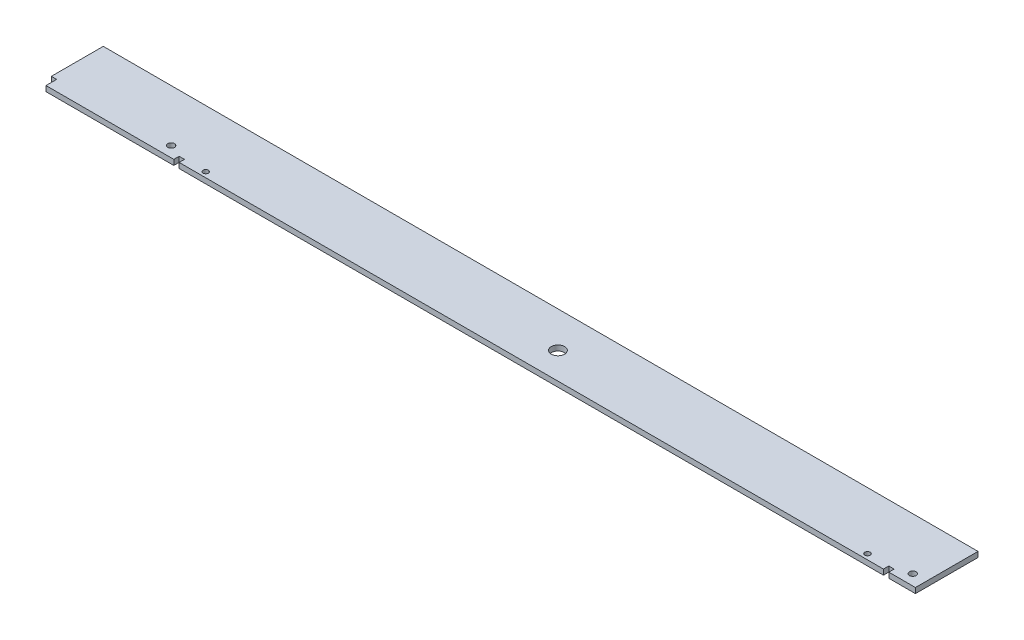
ISO-10303-21;
HEADER;
FILE_DESCRIPTION(('STEP AP214'),'2;1');
FILE_NAME('part.step','',(''),(''),'','','');
FILE_SCHEMA(('AUTOMOTIVE_DESIGN { 1 0 10303 214 1 1 1 1 }'));
ENDSEC;
DATA;
#1=APPLICATION_CONTEXT('core data for automotive mechanical design processes');
#2=APPLICATION_PROTOCOL_DEFINITION('international standard','automotive_design',2000,#1);
#3=PRODUCT_CONTEXT('',#1,'mechanical');
#4=PRODUCT('Part','Part','',(#3));
#5=PRODUCT_RELATED_PRODUCT_CATEGORY('part','',(#4));
#6=PRODUCT_DEFINITION_FORMATION('','',#4);
#7=PRODUCT_DEFINITION_CONTEXT('part definition',#1,'design');
#8=PRODUCT_DEFINITION('design','',#6,#7);
#9=PRODUCT_DEFINITION_SHAPE('','',#8);
#10=(LENGTH_UNIT() NAMED_UNIT(*) SI_UNIT(.MILLI.,.METRE.));
#11=(NAMED_UNIT(*) PLANE_ANGLE_UNIT() SI_UNIT($,.RADIAN.));
#12=(NAMED_UNIT(*) SI_UNIT($,.STERADIAN.) SOLID_ANGLE_UNIT());
#13=UNCERTAINTY_MEASURE_WITH_UNIT(LENGTH_MEASURE(1.E-05),#10,'distance_accuracy_value','');
#14=(GEOMETRIC_REPRESENTATION_CONTEXT(3) GLOBAL_UNCERTAINTY_ASSIGNED_CONTEXT((#13)) GLOBAL_UNIT_ASSIGNED_CONTEXT((#10,
#11,#12)) REPRESENTATION_CONTEXT('',''));
#15=CARTESIAN_POINT('',(0.,0.,0.));
#16=DIRECTION('',(0.,0.,1.));
#17=DIRECTION('',(1.,0.,0.));
#18=AXIS2_PLACEMENT_3D('',#15,#16,#17);
#19=CARTESIAN_POINT('',(0.,4.,0.));
#20=DIRECTION('',(0.,1.,0.));
#21=DIRECTION('',(0.,0.,1.));
#22=AXIS2_PLACEMENT_3D('',#19,#20,#21);
#23=PLANE('',#22);
#24=DIRECTION('',(0.,0.,1.));
#25=VECTOR('',#24,1.);
#26=CARTESIAN_POINT('',(-782.880346614095,4.,180.385173028405));
#27=LINE('',#26,#25);
#28=CARTESIAN_POINT('',(-782.880346614095,4.,172.385173028405));
#29=VERTEX_POINT('',#28);
#30=CARTESIAN_POINT('',(-782.880346614095,4.,180.385173028405));
#31=VERTEX_POINT('',#30);
#32=EDGE_CURVE('E264',#29,#31,#27,.T.);
#33=ORIENTED_EDGE('',*,*,#32,.T.);
#34=DIRECTION('',(1.,0.,0.));
#35=VECTOR('',#34,1.);
#36=CARTESIAN_POINT('',(-686.880346614095,4.,180.385173028405));
#37=LINE('',#36,#35);
#38=CARTESIAN_POINT('',(-686.880346614095,4.,180.385173028405));
#39=VERTEX_POINT('',#38);
#40=EDGE_CURVE('E321',#31,#39,#37,.T.);
#41=ORIENTED_EDGE('',*,*,#40,.T.);
#42=DIRECTION('',(0.,0.,-1.));
#43=VECTOR('',#42,1.);
#44=CARTESIAN_POINT('',(-686.880346614095,4.,176.385173028405));
#45=LINE('',#44,#43);
#46=CARTESIAN_POINT('',(-686.880346614095,4.,176.385173028405));
#47=VERTEX_POINT('',#46);
#48=EDGE_CURVE('E324',#39,#47,#45,.T.);
#49=ORIENTED_EDGE('',*,*,#48,.T.);
#50=DIRECTION('',(1.,0.,0.));
#51=VECTOR('',#50,1.);
#52=CARTESIAN_POINT('',(-682.880346614095,4.,176.385173028405));
#53=LINE('',#52,#51);
#54=CARTESIAN_POINT('',(-682.880346614095,4.,176.385173028405));
#55=VERTEX_POINT('',#54);
#56=EDGE_CURVE('E327',#47,#55,#53,.T.);
#57=ORIENTED_EDGE('',*,*,#56,.T.);
#58=DIRECTION('',(0.,0.,1.));
#59=VECTOR('',#58,1.);
#60=CARTESIAN_POINT('',(-682.880346614095,4.,180.385173028405));
#61=LINE('',#60,#59);
#62=CARTESIAN_POINT('',(-682.880346614095,4.,180.385173028405));
#63=VERTEX_POINT('',#62);
#64=EDGE_CURVE('E330',#55,#63,#61,.T.);
#65=ORIENTED_EDGE('',*,*,#64,.T.);
#66=DIRECTION('',(1.,0.,0.));
#67=VECTOR('',#66,1.);
#68=CARTESIAN_POINT('',(-153.880346614095,4.,180.385173028405));
#69=LINE('',#68,#67);
#70=CARTESIAN_POINT('',(-153.880346614095,4.,180.385173028405));
#71=VERTEX_POINT('',#70);
#72=EDGE_CURVE('E333',#63,#71,#69,.T.);
#73=ORIENTED_EDGE('',*,*,#72,.T.);
#74=DIRECTION('',(0.,0.,-1.));
#75=VECTOR('',#74,1.);
#76=CARTESIAN_POINT('',(-153.880346614095,4.,176.385173028405));
#77=LINE('',#76,#75);
#78=CARTESIAN_POINT('',(-153.880346614095,4.,176.385173028405));
#79=VERTEX_POINT('',#78);
#80=EDGE_CURVE('E149',#71,#79,#77,.T.);
#81=ORIENTED_EDGE('',*,*,#80,.T.);
#82=DIRECTION('',(1.,0.,0.));
#83=VECTOR('',#82,1.);
#84=CARTESIAN_POINT('',(-149.880346614095,4.,176.385173028405));
#85=LINE('',#84,#83);
#86=CARTESIAN_POINT('',(-149.880346614095,4.,176.385173028405));
#87=VERTEX_POINT('',#86);
#88=EDGE_CURVE('E141',#79,#87,#85,.T.);
#89=ORIENTED_EDGE('',*,*,#88,.T.);
#90=DIRECTION('',(0.,0.,1.));
#91=VECTOR('',#90,1.);
#92=CARTESIAN_POINT('',(-149.880346614095,4.,180.385173028405));
#93=LINE('',#92,#91);
#94=CARTESIAN_POINT('',(-149.880346614095,4.,180.385173028405));
#95=VERTEX_POINT('',#94);
#96=EDGE_CURVE('E146',#87,#95,#93,.T.);
#97=ORIENTED_EDGE('',*,*,#96,.T.);
#98=DIRECTION('',(1.,0.,0.));
#99=VECTOR('',#98,1.);
#100=CARTESIAN_POINT('',(-129.880346614095,4.,180.385173028405));
#101=LINE('',#100,#99);
#102=CARTESIAN_POINT('',(-129.880346614095,4.,180.385173028405));
#103=VERTEX_POINT('',#102);
#104=EDGE_CURVE('E66',#95,#103,#101,.T.);
#105=ORIENTED_EDGE('',*,*,#104,.T.);
#106=DIRECTION('',(0.,0.,-1.));
#107=VECTOR('',#106,1.);
#108=CARTESIAN_POINT('',(-129.880346614095,4.,180.385173028405));
#109=LINE('',#108,#107);
#110=CARTESIAN_POINT('',(-129.880346614095,4.,133.385173028405));
#111=VERTEX_POINT('',#110);
#112=EDGE_CURVE('E211',#103,#111,#109,.T.);
#113=ORIENTED_EDGE('',*,*,#112,.T.);
#114=DIRECTION('',(-1.,0.,0.));
#115=VECTOR('',#114,1.);
#116=CARTESIAN_POINT('',(-129.880346614095,4.,133.385173028405));
#117=LINE('',#116,#115);
#118=CARTESIAN_POINT('',(-786.880346614095,4.,133.385173028405));
#119=VERTEX_POINT('',#118);
#120=EDGE_CURVE('E116',#111,#119,#117,.T.);
#121=ORIENTED_EDGE('',*,*,#120,.T.);
#122=DIRECTION('',(0.,0.,1.));
#123=VECTOR('',#122,1.);
#124=CARTESIAN_POINT('',(-786.880346614095,4.,180.385173028405));
#125=LINE('',#124,#123);
#126=CARTESIAN_POINT('',(-786.880346614095,4.,172.385173028405));
#127=VERTEX_POINT('',#126);
#128=EDGE_CURVE('E246',#119,#127,#125,.T.);
#129=ORIENTED_EDGE('',*,*,#128,.T.);
#130=DIRECTION('',(1.,0.,0.));
#131=VECTOR('',#130,1.);
#132=CARTESIAN_POINT('',(-786.880346614095,4.,172.385173028405));
#133=LINE('',#132,#131);
#134=EDGE_CURVE('E261',#127,#29,#133,.T.);
#135=ORIENTED_EDGE('',*,*,#134,.T.);
#136=EDGE_LOOP('',(#33,#41,#49,#57,#65,#73,#81,#89,#97,#105,#113,#121,#129,#135));
#137=FACE_BOUND('',#136,.T.);
#138=CARTESIAN_POINT('',(-169.880346614095,4.,176.385173028405));
#139=DIRECTION('',(0.,1.,0.));
#140=DIRECTION('',(0.,0.,1.));
#141=AXIS2_PLACEMENT_3D('',#138,#139,#140);
#142=CIRCLE('',#141,2.);
#143=CARTESIAN_POINT('',(-169.880346614095,4.,178.385173028405));
#144=VERTEX_POINT('',#143);
#145=EDGE_CURVE('E285',#144,#144,#142,.T.);
#146=ORIENTED_EDGE('',*,*,#145,.F.);
#147=EDGE_LOOP('',(#146));
#148=FACE_BOUND('',#147,.T.);
#149=CARTESIAN_POINT('',(-139.880346614095,4.,172.385173028405));
#150=DIRECTION('',(0.,1.,0.));
#151=DIRECTION('',(0.,0.,1.));
#152=AXIS2_PLACEMENT_3D('',#149,#150,#151);
#153=CIRCLE('',#152,2.50000000000003);
#154=CARTESIAN_POINT('',(-139.880346614095,4.,174.885173028405));
#155=VERTEX_POINT('',#154);
#156=EDGE_CURVE('E301',#155,#155,#153,.T.);
#157=ORIENTED_EDGE('',*,*,#156,.F.);
#158=EDGE_LOOP('',(#157));
#159=FACE_BOUND('',#158,.T.);
#160=CARTESIAN_POINT('',(-696.880346614095,4.,172.385173028405));
#161=DIRECTION('',(0.,1.,0.));
#162=DIRECTION('',(0.,0.,1.));
#163=AXIS2_PLACEMENT_3D('',#160,#161,#162);
#164=CIRCLE('',#163,2.50000000000002);
#165=CARTESIAN_POINT('',(-696.880346614095,4.,174.885173028405));
#166=VERTEX_POINT('',#165);
#167=EDGE_CURVE('E179',#166,#166,#164,.T.);
#168=ORIENTED_EDGE('',*,*,#167,.F.);
#169=EDGE_LOOP('',(#168));
#170=FACE_BOUND('',#169,.T.);
#171=CARTESIAN_POINT('',(-666.880346614095,4.,176.385173028405));
#172=DIRECTION('',(0.,1.,0.));
#173=DIRECTION('',(0.,0.,1.));
#174=AXIS2_PLACEMENT_3D('',#171,#172,#173);
#175=CIRCLE('',#174,2.);
#176=CARTESIAN_POINT('',(-666.880346614095,4.,178.385173028405));
#177=VERTEX_POINT('',#176);
#178=EDGE_CURVE('E293',#177,#177,#175,.T.);
#179=ORIENTED_EDGE('',*,*,#178,.F.);
#180=EDGE_LOOP('',(#179));
#181=FACE_BOUND('',#180,.T.);
#182=CARTESIAN_POINT('',(-418.380346614095,4.,160.385173028405));
#183=DIRECTION('',(0.,1.,0.));
#184=DIRECTION('',(0.,0.,1.));
#185=AXIS2_PLACEMENT_3D('',#182,#183,#184);
#186=CIRCLE('',#185,4.99999999999999);
#187=CARTESIAN_POINT('',(-418.380346614095,4.,165.385173028405));
#188=VERTEX_POINT('',#187);
#189=EDGE_CURVE('E277',#188,#188,#186,.T.);
#190=ORIENTED_EDGE('',*,*,#189,.F.);
#191=EDGE_LOOP('',(#190));
#192=FACE_BOUND('',#191,.T.);
#193=ADVANCED_FACE('F41',(#137,#148,#159,#170,#181,#192),#23,.T.);
#194=CARTESIAN_POINT('',(0.,0.,0.));
#195=DIRECTION('',(0.,1.,0.));
#196=DIRECTION('',(0.,0.,1.));
#197=AXIS2_PLACEMENT_3D('',#194,#195,#196);
#198=PLANE('',#197);
#199=DIRECTION('',(1.,0.,0.));
#200=VECTOR('',#199,1.);
#201=CARTESIAN_POINT('',(-686.880346614095,0.,180.385173028405));
#202=LINE('',#201,#200);
#203=CARTESIAN_POINT('',(-782.880346614095,0.,180.385173028405));
#204=VERTEX_POINT('',#203);
#205=CARTESIAN_POINT('',(-686.880346614095,0.,180.385173028405));
#206=VERTEX_POINT('',#205);
#207=EDGE_CURVE('E186',#204,#206,#202,.T.);
#208=ORIENTED_EDGE('',*,*,#207,.F.);
#209=DIRECTION('',(0.,0.,1.));
#210=VECTOR('',#209,1.);
#211=CARTESIAN_POINT('',(-782.880346614095,0.,180.385173028405));
#212=LINE('',#211,#210);
#213=CARTESIAN_POINT('',(-782.880346614095,0.,172.385173028405));
#214=VERTEX_POINT('',#213);
#215=EDGE_CURVE('E57',#214,#204,#212,.T.);
#216=ORIENTED_EDGE('',*,*,#215,.F.);
#217=DIRECTION('',(1.,0.,0.));
#218=VECTOR('',#217,1.);
#219=CARTESIAN_POINT('',(-786.880346614095,0.,172.385173028405));
#220=LINE('',#219,#218);
#221=CARTESIAN_POINT('',(-786.880346614095,0.,172.385173028405));
#222=VERTEX_POINT('',#221);
#223=EDGE_CURVE('E254',#222,#214,#220,.T.);
#224=ORIENTED_EDGE('',*,*,#223,.F.);
#225=DIRECTION('',(0.,0.,1.));
#226=VECTOR('',#225,1.);
#227=CARTESIAN_POINT('',(-786.880346614095,0.,180.385173028405));
#228=LINE('',#227,#226);
#229=CARTESIAN_POINT('',(-786.880346614095,0.,133.385173028405));
#230=VERTEX_POINT('',#229);
#231=EDGE_CURVE('E182',#230,#222,#228,.T.);
#232=ORIENTED_EDGE('',*,*,#231,.F.);
#233=DIRECTION('',(-1.,0.,0.));
#234=VECTOR('',#233,1.);
#235=CARTESIAN_POINT('',(-129.880346614095,0.,133.385173028405));
#236=LINE('',#235,#234);
#237=CARTESIAN_POINT('',(-129.880346614095,0.,133.385173028405));
#238=VERTEX_POINT('',#237);
#239=EDGE_CURVE('E178',#238,#230,#236,.T.);
#240=ORIENTED_EDGE('',*,*,#239,.F.);
#241=DIRECTION('',(0.,0.,-1.));
#242=VECTOR('',#241,1.);
#243=CARTESIAN_POINT('',(-129.880346614095,0.,180.385173028405));
#244=LINE('',#243,#242);
#245=CARTESIAN_POINT('',(-129.880346614095,0.,180.385173028405));
#246=VERTEX_POINT('',#245);
#247=EDGE_CURVE('E174',#246,#238,#244,.T.);
#248=ORIENTED_EDGE('',*,*,#247,.F.);
#249=DIRECTION('',(1.,0.,0.));
#250=VECTOR('',#249,1.);
#251=CARTESIAN_POINT('',(-129.880346614095,0.,180.385173028405));
#252=LINE('',#251,#250);
#253=CARTESIAN_POINT('',(-149.880346614095,0.,180.385173028405));
#254=VERTEX_POINT('',#253);
#255=EDGE_CURVE('E108',#254,#246,#252,.T.);
#256=ORIENTED_EDGE('',*,*,#255,.F.);
#257=DIRECTION('',(0.,0.,1.));
#258=VECTOR('',#257,1.);
#259=CARTESIAN_POINT('',(-149.880346614095,0.,180.385173028405));
#260=LINE('',#259,#258);
#261=CARTESIAN_POINT('',(-149.880346614095,0.,176.385173028405));
#262=VERTEX_POINT('',#261);
#263=EDGE_CURVE('E206',#262,#254,#260,.T.);
#264=ORIENTED_EDGE('',*,*,#263,.F.);
#265=DIRECTION('',(1.,0.,0.));
#266=VECTOR('',#265,1.);
#267=CARTESIAN_POINT('',(-149.880346614095,0.,176.385173028405));
#268=LINE('',#267,#266);
#269=CARTESIAN_POINT('',(-153.880346614095,0.,176.385173028405));
#270=VERTEX_POINT('',#269);
#271=EDGE_CURVE('E159',#270,#262,#268,.T.);
#272=ORIENTED_EDGE('',*,*,#271,.F.);
#273=DIRECTION('',(0.,0.,-1.));
#274=VECTOR('',#273,1.);
#275=CARTESIAN_POINT('',(-153.880346614095,0.,176.385173028405));
#276=LINE('',#275,#274);
#277=CARTESIAN_POINT('',(-153.880346614095,0.,180.385173028405));
#278=VERTEX_POINT('',#277);
#279=EDGE_CURVE('E201',#278,#270,#276,.T.);
#280=ORIENTED_EDGE('',*,*,#279,.F.);
#281=DIRECTION('',(1.,0.,0.));
#282=VECTOR('',#281,1.);
#283=CARTESIAN_POINT('',(-153.880346614095,0.,180.385173028405));
#284=LINE('',#283,#282);
#285=CARTESIAN_POINT('',(-682.880346614095,0.,180.385173028405));
#286=VERTEX_POINT('',#285);
#287=EDGE_CURVE('E198',#286,#278,#284,.T.);
#288=ORIENTED_EDGE('',*,*,#287,.F.);
#289=DIRECTION('',(0.,0.,1.));
#290=VECTOR('',#289,1.);
#291=CARTESIAN_POINT('',(-682.880346614095,0.,180.385173028405));
#292=LINE('',#291,#290);
#293=CARTESIAN_POINT('',(-682.880346614095,0.,176.385173028405));
#294=VERTEX_POINT('',#293);
#295=EDGE_CURVE('E195',#294,#286,#292,.T.);
#296=ORIENTED_EDGE('',*,*,#295,.F.);
#297=DIRECTION('',(1.,0.,0.));
#298=VECTOR('',#297,1.);
#299=CARTESIAN_POINT('',(-682.880346614095,0.,176.385173028405));
#300=LINE('',#299,#298);
#301=CARTESIAN_POINT('',(-686.880346614095,0.,176.385173028405));
#302=VERTEX_POINT('',#301);
#303=EDGE_CURVE('E192',#302,#294,#300,.T.);
#304=ORIENTED_EDGE('',*,*,#303,.F.);
#305=DIRECTION('',(0.,0.,-1.));
#306=VECTOR('',#305,1.);
#307=CARTESIAN_POINT('',(-686.880346614095,0.,176.385173028405));
#308=LINE('',#307,#306);
#309=EDGE_CURVE('E189',#206,#302,#308,.T.);
#310=ORIENTED_EDGE('',*,*,#309,.F.);
#311=EDGE_LOOP('',(#208,#216,#224,#232,#240,#248,#256,#264,#272,#280,#288,#296,#304,#310));
#312=FACE_BOUND('',#311,.T.);
#313=CARTESIAN_POINT('',(-696.880346614095,0.,172.385173028405));
#314=DIRECTION('',(0.,1.,0.));
#315=DIRECTION('',(0.,0.,1.));
#316=AXIS2_PLACEMENT_3D('',#313,#314,#315);
#317=CIRCLE('',#316,2.50000000000002);
#318=CARTESIAN_POINT('',(-696.880346614095,0.,174.885173028405));
#319=VERTEX_POINT('',#318);
#320=EDGE_CURVE('E305',#319,#319,#317,.T.);
#321=ORIENTED_EDGE('',*,*,#320,.T.);
#322=EDGE_LOOP('',(#321));
#323=FACE_BOUND('',#322,.T.);
#324=CARTESIAN_POINT('',(-139.880346614095,0.,172.385173028405));
#325=DIRECTION('',(0.,1.,0.));
#326=DIRECTION('',(0.,0.,1.));
#327=AXIS2_PLACEMENT_3D('',#324,#325,#326);
#328=CIRCLE('',#327,2.50000000000003);
#329=CARTESIAN_POINT('',(-139.880346614095,0.,174.885173028405));
#330=VERTEX_POINT('',#329);
#331=EDGE_CURVE('E297',#330,#330,#328,.T.);
#332=ORIENTED_EDGE('',*,*,#331,.T.);
#333=EDGE_LOOP('',(#332));
#334=FACE_BOUND('',#333,.T.);
#335=CARTESIAN_POINT('',(-666.880346614095,0.,176.385173028405));
#336=DIRECTION('',(0.,1.,0.));
#337=DIRECTION('',(0.,0.,1.));
#338=AXIS2_PLACEMENT_3D('',#335,#336,#337);
#339=CIRCLE('',#338,2.);
#340=CARTESIAN_POINT('',(-666.880346614095,0.,178.385173028405));
#341=VERTEX_POINT('',#340);
#342=EDGE_CURVE('E289',#341,#341,#339,.T.);
#343=ORIENTED_EDGE('',*,*,#342,.T.);
#344=EDGE_LOOP('',(#343));
#345=FACE_BOUND('',#344,.T.);
#346=CARTESIAN_POINT('',(-169.880346614095,0.,176.385173028405));
#347=DIRECTION('',(0.,1.,0.));
#348=DIRECTION('',(0.,0.,1.));
#349=AXIS2_PLACEMENT_3D('',#346,#347,#348);
#350=CIRCLE('',#349,2.);
#351=CARTESIAN_POINT('',(-169.880346614095,0.,178.385173028405));
#352=VERTEX_POINT('',#351);
#353=EDGE_CURVE('E281',#352,#352,#350,.T.);
#354=ORIENTED_EDGE('',*,*,#353,.T.);
#355=EDGE_LOOP('',(#354));
#356=FACE_BOUND('',#355,.T.);
#357=CARTESIAN_POINT('',(-418.380346614095,0.,160.385173028405));
#358=DIRECTION('',(0.,1.,0.));
#359=DIRECTION('',(0.,0.,1.));
#360=AXIS2_PLACEMENT_3D('',#357,#358,#359);
#361=CIRCLE('',#360,4.99999999999999);
#362=CARTESIAN_POINT('',(-418.380346614095,0.,165.385173028405));
#363=VERTEX_POINT('',#362);
#364=EDGE_CURVE('E270',#363,#363,#361,.T.);
#365=ORIENTED_EDGE('',*,*,#364,.T.);
#366=EDGE_LOOP('',(#365));
#367=FACE_BOUND('',#366,.T.);
#368=ADVANCED_FACE('F250',(#312,#323,#334,#345,#356,#367),#198,.F.);
#369=CARTESIAN_POINT('',(-129.880346614095,4.,180.385173028405));
#370=DIRECTION('',(-1.,0.,0.));
#371=DIRECTION('',(0.,0.,1.));
#372=AXIS2_PLACEMENT_3D('',#369,#370,#371);
#373=PLANE('',#372);
#374=ORIENTED_EDGE('',*,*,#247,.T.);
#375=DIRECTION('',(0.,-1.,0.));
#376=VECTOR('',#375,1.);
#377=CARTESIAN_POINT('',(-129.880346614095,4.,133.385173028405));
#378=LINE('',#377,#376);
#379=EDGE_CURVE('E11',#111,#238,#378,.T.);
#380=ORIENTED_EDGE('',*,*,#379,.F.);
#381=ORIENTED_EDGE('',*,*,#112,.F.);
#382=DIRECTION('',(0.,-1.,0.));
#383=VECTOR('',#382,1.);
#384=CARTESIAN_POINT('',(-129.880346614095,4.,180.385173028405));
#385=LINE('',#384,#383);
#386=EDGE_CURVE('E170',#103,#246,#385,.T.);
#387=ORIENTED_EDGE('',*,*,#386,.T.);
#388=EDGE_LOOP('',(#374,#380,#381,#387));
#389=FACE_BOUND('',#388,.T.);
#390=ADVANCED_FACE('F43',(#389),#373,.F.);
#391=CARTESIAN_POINT('',(-129.880346614095,4.,133.385173028405));
#392=DIRECTION('',(0.,0.,1.));
#393=DIRECTION('',(1.,0.,0.));
#394=AXIS2_PLACEMENT_3D('',#391,#392,#393);
#395=PLANE('',#394);
#396=ORIENTED_EDGE('',*,*,#239,.T.);
#397=DIRECTION('',(0.,-1.,0.));
#398=VECTOR('',#397,1.);
#399=CARTESIAN_POINT('',(-786.880346614095,4.,133.385173028405));
#400=LINE('',#399,#398);
#401=EDGE_CURVE('E50',#119,#230,#400,.T.);
#402=ORIENTED_EDGE('',*,*,#401,.F.);
#403=ORIENTED_EDGE('',*,*,#120,.F.);
#404=ORIENTED_EDGE('',*,*,#379,.T.);
#405=EDGE_LOOP('',(#396,#402,#403,#404));
#406=FACE_BOUND('',#405,.T.);
#407=ADVANCED_FACE('F379',(#406),#395,.F.);
#408=CARTESIAN_POINT('',(-786.880346614095,4.,180.385173028405));
#409=DIRECTION('',(1.,0.,0.));
#410=DIRECTION('',(0.,0.,-1.));
#411=AXIS2_PLACEMENT_3D('',#408,#409,#410);
#412=PLANE('',#411);
#413=ORIENTED_EDGE('',*,*,#231,.T.);
#414=DIRECTION('',(0.,-1.,0.));
#415=VECTOR('',#414,1.);
#416=CARTESIAN_POINT('',(-786.880346614095,4.,172.385173028405));
#417=LINE('',#416,#415);
#418=EDGE_CURVE('E274',#127,#222,#417,.T.);
#419=ORIENTED_EDGE('',*,*,#418,.F.);
#420=ORIENTED_EDGE('',*,*,#128,.F.);
#421=ORIENTED_EDGE('',*,*,#401,.T.);
#422=EDGE_LOOP('',(#413,#419,#420,#421));
#423=FACE_BOUND('',#422,.T.);
#424=ADVANCED_FACE('F242',(#423),#412,.F.);
#425=CARTESIAN_POINT('',(-686.880346614095,4.,180.385173028405));
#426=DIRECTION('',(0.,0.,-1.));
#427=DIRECTION('',(-1.,0.,0.));
#428=AXIS2_PLACEMENT_3D('',#425,#426,#427);
#429=PLANE('',#428);
#430=ORIENTED_EDGE('',*,*,#40,.F.);
#431=DIRECTION('',(0.,-1.,0.));
#432=VECTOR('',#431,1.);
#433=CARTESIAN_POINT('',(-782.880346614095,4.,180.385173028405));
#434=LINE('',#433,#432);
#435=EDGE_CURVE('E267',#31,#204,#434,.T.);
#436=ORIENTED_EDGE('',*,*,#435,.T.);
#437=ORIENTED_EDGE('',*,*,#207,.T.);
#438=DIRECTION('',(0.,-1.,0.));
#439=VECTOR('',#438,1.);
#440=CARTESIAN_POINT('',(-686.880346614095,4.,180.385173028405));
#441=LINE('',#440,#439);
#442=EDGE_CURVE('E234',#39,#206,#441,.T.);
#443=ORIENTED_EDGE('',*,*,#442,.F.);
#444=EDGE_LOOP('',(#430,#436,#437,#443));
#445=FACE_BOUND('',#444,.T.);
#446=ADVANCED_FACE('F350',(#445),#429,.F.);
#447=CARTESIAN_POINT('',(-686.880346614095,4.,176.385173028405));
#448=DIRECTION('',(-1.,0.,0.));
#449=DIRECTION('',(0.,0.,1.));
#450=AXIS2_PLACEMENT_3D('',#447,#448,#449);
#451=PLANE('',#450);
#452=ORIENTED_EDGE('',*,*,#309,.T.);
#453=DIRECTION('',(0.,-1.,0.));
#454=VECTOR('',#453,1.);
#455=CARTESIAN_POINT('',(-686.880346614095,4.,176.385173028405));
#456=LINE('',#455,#454);
#457=EDGE_CURVE('E230',#47,#302,#456,.T.);
#458=ORIENTED_EDGE('',*,*,#457,.F.);
#459=ORIENTED_EDGE('',*,*,#48,.F.);
#460=ORIENTED_EDGE('',*,*,#442,.T.);
#461=EDGE_LOOP('',(#452,#458,#459,#460));
#462=FACE_BOUND('',#461,.T.);
#463=ADVANCED_FACE('F357',(#462),#451,.F.);
#464=CARTESIAN_POINT('',(-682.880346614095,4.,176.385173028405));
#465=DIRECTION('',(0.,0.,-1.));
#466=DIRECTION('',(-1.,0.,0.));
#467=AXIS2_PLACEMENT_3D('',#464,#465,#466);
#468=PLANE('',#467);
#469=ORIENTED_EDGE('',*,*,#303,.T.);
#470=DIRECTION('',(0.,-1.,0.));
#471=VECTOR('',#470,1.);
#472=CARTESIAN_POINT('',(-682.880346614095,4.,176.385173028405));
#473=LINE('',#472,#471);
#474=EDGE_CURVE('E226',#55,#294,#473,.T.);
#475=ORIENTED_EDGE('',*,*,#474,.F.);
#476=ORIENTED_EDGE('',*,*,#56,.F.);
#477=ORIENTED_EDGE('',*,*,#457,.T.);
#478=EDGE_LOOP('',(#469,#475,#476,#477));
#479=FACE_BOUND('',#478,.T.);
#480=ADVANCED_FACE('F361',(#479),#468,.F.);
#481=CARTESIAN_POINT('',(-682.880346614095,4.,180.385173028405));
#482=DIRECTION('',(1.,0.,0.));
#483=DIRECTION('',(0.,0.,-1.));
#484=AXIS2_PLACEMENT_3D('',#481,#482,#483);
#485=PLANE('',#484);
#486=ORIENTED_EDGE('',*,*,#295,.T.);
#487=DIRECTION('',(0.,-1.,0.));
#488=VECTOR('',#487,1.);
#489=CARTESIAN_POINT('',(-682.880346614095,4.,180.385173028405));
#490=LINE('',#489,#488);
#491=EDGE_CURVE('E222',#63,#286,#490,.T.);
#492=ORIENTED_EDGE('',*,*,#491,.F.);
#493=ORIENTED_EDGE('',*,*,#64,.F.);
#494=ORIENTED_EDGE('',*,*,#474,.T.);
#495=EDGE_LOOP('',(#486,#492,#493,#494));
#496=FACE_BOUND('',#495,.T.);
#497=ADVANCED_FACE('F368',(#496),#485,.F.);
#498=CARTESIAN_POINT('',(-153.880346614095,4.,180.385173028405));
#499=DIRECTION('',(0.,0.,-1.));
#500=DIRECTION('',(-1.,0.,0.));
#501=AXIS2_PLACEMENT_3D('',#498,#499,#500);
#502=PLANE('',#501);
#503=ORIENTED_EDGE('',*,*,#287,.T.);
#504=DIRECTION('',(0.,-1.,0.));
#505=VECTOR('',#504,1.);
#506=CARTESIAN_POINT('',(-153.880346614095,4.,180.385173028405));
#507=LINE('',#506,#505);
#508=EDGE_CURVE('E218',#71,#278,#507,.T.);
#509=ORIENTED_EDGE('',*,*,#508,.F.);
#510=ORIENTED_EDGE('',*,*,#72,.F.);
#511=ORIENTED_EDGE('',*,*,#491,.T.);
#512=EDGE_LOOP('',(#503,#509,#510,#511));
#513=FACE_BOUND('',#512,.T.);
#514=ADVANCED_FACE('F371',(#513),#502,.F.);
#515=CARTESIAN_POINT('',(-153.880346614095,4.,176.385173028405));
#516=DIRECTION('',(-1.,0.,0.));
#517=DIRECTION('',(0.,0.,1.));
#518=AXIS2_PLACEMENT_3D('',#515,#516,#517);
#519=PLANE('',#518);
#520=ORIENTED_EDGE('',*,*,#279,.T.);
#521=DIRECTION('',(0.,-1.,0.));
#522=VECTOR('',#521,1.);
#523=CARTESIAN_POINT('',(-153.880346614095,4.,176.385173028405));
#524=LINE('',#523,#522);
#525=EDGE_CURVE('E163',#79,#270,#524,.T.);
#526=ORIENTED_EDGE('',*,*,#525,.F.);
#527=ORIENTED_EDGE('',*,*,#80,.F.);
#528=ORIENTED_EDGE('',*,*,#508,.T.);
#529=EDGE_LOOP('',(#520,#526,#527,#528));
#530=FACE_BOUND('',#529,.T.);
#531=ADVANCED_FACE('F374',(#530),#519,.F.);
#532=CARTESIAN_POINT('',(-149.880346614095,4.,176.385173028405));
#533=DIRECTION('',(0.,0.,-1.));
#534=DIRECTION('',(-1.,0.,0.));
#535=AXIS2_PLACEMENT_3D('',#532,#533,#534);
#536=PLANE('',#535);
#537=ORIENTED_EDGE('',*,*,#271,.T.);
#538=DIRECTION('',(0.,-1.,0.));
#539=VECTOR('',#538,1.);
#540=CARTESIAN_POINT('',(-149.880346614095,4.,176.385173028405));
#541=LINE('',#540,#539);
#542=EDGE_CURVE('E156',#87,#262,#541,.T.);
#543=ORIENTED_EDGE('',*,*,#542,.F.);
#544=ORIENTED_EDGE('',*,*,#88,.F.);
#545=ORIENTED_EDGE('',*,*,#525,.T.);
#546=EDGE_LOOP('',(#537,#543,#544,#545));
#547=FACE_BOUND('',#546,.T.);
#548=ADVANCED_FACE('F157',(#547),#536,.F.);
#549=CARTESIAN_POINT('',(-149.880346614095,4.,180.385173028405));
#550=DIRECTION('',(1.,0.,0.));
#551=DIRECTION('',(0.,0.,-1.));
#552=AXIS2_PLACEMENT_3D('',#549,#550,#551);
#553=PLANE('',#552);
#554=ORIENTED_EDGE('',*,*,#263,.T.);
#555=DIRECTION('',(0.,-1.,0.));
#556=VECTOR('',#555,1.);
#557=CARTESIAN_POINT('',(-149.880346614095,4.,180.385173028405));
#558=LINE('',#557,#556);
#559=EDGE_CURVE('E164',#95,#254,#558,.T.);
#560=ORIENTED_EDGE('',*,*,#559,.F.);
#561=ORIENTED_EDGE('',*,*,#96,.F.);
#562=ORIENTED_EDGE('',*,*,#542,.T.);
#563=EDGE_LOOP('',(#554,#560,#561,#562));
#564=FACE_BOUND('',#563,.T.);
#565=ADVANCED_FACE('F166',(#564),#553,.F.);
#566=CARTESIAN_POINT('',(-129.880346614095,4.,180.385173028405));
#567=DIRECTION('',(0.,0.,-1.));
#568=DIRECTION('',(-1.,0.,0.));
#569=AXIS2_PLACEMENT_3D('',#566,#567,#568);
#570=PLANE('',#569);
#571=ORIENTED_EDGE('',*,*,#255,.T.);
#572=ORIENTED_EDGE('',*,*,#386,.F.);
#573=ORIENTED_EDGE('',*,*,#104,.F.);
#574=ORIENTED_EDGE('',*,*,#559,.T.);
#575=EDGE_LOOP('',(#571,#572,#573,#574));
#576=FACE_BOUND('',#575,.T.);
#577=ADVANCED_FACE('F375',(#576),#570,.F.);
#578=CARTESIAN_POINT('',(-696.880346614095,4.,172.385173028405));
#579=DIRECTION('',(0.,-1.,0.));
#580=DIRECTION('',(0.,0.,-1.));
#581=AXIS2_PLACEMENT_3D('',#578,#579,#580);
#582=CYLINDRICAL_SURFACE('',#581,2.50000000000002);
#583=ORIENTED_EDGE('',*,*,#167,.T.);
#584=EDGE_LOOP('',(#583));
#585=FACE_BOUND('',#584,.T.);
#586=ORIENTED_EDGE('',*,*,#320,.F.);
#587=EDGE_LOOP('',(#586));
#588=FACE_BOUND('',#587,.T.);
#589=ADVANCED_FACE('F393',(#585,#588),#582,.F.);
#590=CARTESIAN_POINT('',(-139.880346614095,4.,172.385173028405));
#591=DIRECTION('',(0.,-1.,0.));
#592=DIRECTION('',(0.,0.,-1.));
#593=AXIS2_PLACEMENT_3D('',#590,#591,#592);
#594=CYLINDRICAL_SURFACE('',#593,2.50000000000003);
#595=ORIENTED_EDGE('',*,*,#156,.T.);
#596=EDGE_LOOP('',(#595));
#597=FACE_BOUND('',#596,.T.);
#598=ORIENTED_EDGE('',*,*,#331,.F.);
#599=EDGE_LOOP('',(#598));
#600=FACE_BOUND('',#599,.T.);
#601=ADVANCED_FACE('F456',(#597,#600),#594,.F.);
#602=CARTESIAN_POINT('',(-666.880346614095,4.,176.385173028405));
#603=DIRECTION('',(0.,-1.,0.));
#604=DIRECTION('',(0.,0.,-1.));
#605=AXIS2_PLACEMENT_3D('',#602,#603,#604);
#606=CYLINDRICAL_SURFACE('',#605,2.);
#607=ORIENTED_EDGE('',*,*,#178,.T.);
#608=EDGE_LOOP('',(#607));
#609=FACE_BOUND('',#608,.T.);
#610=ORIENTED_EDGE('',*,*,#342,.F.);
#611=EDGE_LOOP('',(#610));
#612=FACE_BOUND('',#611,.T.);
#613=ADVANCED_FACE('F463',(#609,#612),#606,.F.);
#614=CARTESIAN_POINT('',(-169.880346614095,4.,176.385173028405));
#615=DIRECTION('',(0.,-1.,0.));
#616=DIRECTION('',(0.,0.,-1.));
#617=AXIS2_PLACEMENT_3D('',#614,#615,#616);
#618=CYLINDRICAL_SURFACE('',#617,2.);
#619=ORIENTED_EDGE('',*,*,#145,.T.);
#620=EDGE_LOOP('',(#619));
#621=FACE_BOUND('',#620,.T.);
#622=ORIENTED_EDGE('',*,*,#353,.F.);
#623=EDGE_LOOP('',(#622));
#624=FACE_BOUND('',#623,.T.);
#625=ADVANCED_FACE('F470',(#621,#624),#618,.F.);
#626=CARTESIAN_POINT('',(-418.380346614095,4.,160.385173028405));
#627=DIRECTION('',(0.,-1.,0.));
#628=DIRECTION('',(0.,0.,-1.));
#629=AXIS2_PLACEMENT_3D('',#626,#627,#628);
#630=CYLINDRICAL_SURFACE('',#629,4.99999999999999);
#631=ORIENTED_EDGE('',*,*,#189,.T.);
#632=EDGE_LOOP('',(#631));
#633=FACE_BOUND('',#632,.T.);
#634=ORIENTED_EDGE('',*,*,#364,.F.);
#635=EDGE_LOOP('',(#634));
#636=FACE_BOUND('',#635,.T.);
#637=ADVANCED_FACE('F478',(#633,#636),#630,.F.);
#638=CARTESIAN_POINT('',(-782.880346614095,4.,180.385173028405));
#639=DIRECTION('',(1.,0.,0.));
#640=DIRECTION('',(0.,0.,-1.));
#641=AXIS2_PLACEMENT_3D('',#638,#639,#640);
#642=PLANE('',#641);
#643=ORIENTED_EDGE('',*,*,#215,.T.);
#644=ORIENTED_EDGE('',*,*,#435,.F.);
#645=ORIENTED_EDGE('',*,*,#32,.F.);
#646=DIRECTION('',(0.,-1.,0.));
#647=VECTOR('',#646,1.);
#648=CARTESIAN_POINT('',(-782.880346614095,4.,172.385173028405));
#649=LINE('',#648,#647);
#650=EDGE_CURVE('E271',#29,#214,#649,.T.);
#651=ORIENTED_EDGE('',*,*,#650,.T.);
#652=EDGE_LOOP('',(#643,#644,#645,#651));
#653=FACE_BOUND('',#652,.T.);
#654=ADVANCED_FACE('F348',(#653),#642,.F.);
#655=CARTESIAN_POINT('',(-786.880346614095,4.,172.385173028405));
#656=DIRECTION('',(0.,0.,-1.));
#657=DIRECTION('',(-1.,0.,0.));
#658=AXIS2_PLACEMENT_3D('',#655,#656,#657);
#659=PLANE('',#658);
#660=ORIENTED_EDGE('',*,*,#223,.T.);
#661=ORIENTED_EDGE('',*,*,#650,.F.);
#662=ORIENTED_EDGE('',*,*,#134,.F.);
#663=ORIENTED_EDGE('',*,*,#418,.T.);
#664=EDGE_LOOP('',(#660,#661,#662,#663));
#665=FACE_BOUND('',#664,.T.);
#666=ADVANCED_FACE('F345',(#665),#659,.F.);
#667=CLOSED_SHELL('',(#193,#368,#390,#407,#424,#446,#463,#480,#497,#514,#531,#548,#565,#577,
#589,#601,#613,#625,#637,#654,#666));
#668=MANIFOLD_SOLID_BREP('B2',#667);
#669=ADVANCED_BREP_SHAPE_REPRESENTATION('',(#18,#668),#14);
#670=SHAPE_DEFINITION_REPRESENTATION(#9,#669);
ENDSEC;
END-ISO-10303-21;
